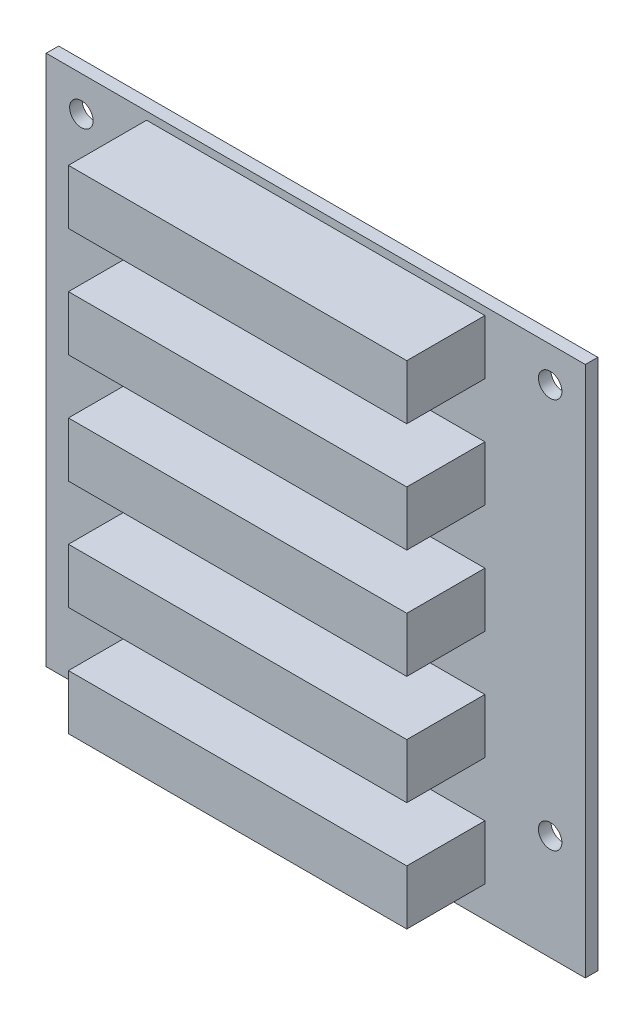
ISO-10303-21;
HEADER;
FILE_DESCRIPTION(('STEP AP214'),'2;1');
FILE_NAME('part.step','',(''),(''),'','','');
FILE_SCHEMA(('AUTOMOTIVE_DESIGN { 1 0 10303 214 1 1 1 1 }'));
ENDSEC;
DATA;
#1=APPLICATION_CONTEXT('core data for automotive mechanical design processes');
#2=APPLICATION_PROTOCOL_DEFINITION('international standard','automotive_design',2000,#1);
#3=PRODUCT_CONTEXT('',#1,'mechanical');
#4=PRODUCT('Part','Part','',(#3));
#5=PRODUCT_RELATED_PRODUCT_CATEGORY('part','',(#4));
#6=PRODUCT_DEFINITION_FORMATION('','',#4);
#7=PRODUCT_DEFINITION_CONTEXT('part definition',#1,'design');
#8=PRODUCT_DEFINITION('design','',#6,#7);
#9=PRODUCT_DEFINITION_SHAPE('','',#8);
#10=(LENGTH_UNIT() NAMED_UNIT(*) SI_UNIT(.MILLI.,.METRE.));
#11=(NAMED_UNIT(*) PLANE_ANGLE_UNIT() SI_UNIT($,.RADIAN.));
#12=(NAMED_UNIT(*) SI_UNIT($,.STERADIAN.) SOLID_ANGLE_UNIT());
#13=UNCERTAINTY_MEASURE_WITH_UNIT(LENGTH_MEASURE(1.E-05),#10,'distance_accuracy_value','');
#14=(GEOMETRIC_REPRESENTATION_CONTEXT(3) GLOBAL_UNCERTAINTY_ASSIGNED_CONTEXT((#13)) GLOBAL_UNIT_ASSIGNED_CONTEXT((#10,
#11,#12)) REPRESENTATION_CONTEXT('',''));
#15=CARTESIAN_POINT('',(0.,0.,0.));
#16=DIRECTION('',(0.,0.,1.));
#17=DIRECTION('',(1.,0.,0.));
#18=AXIS2_PLACEMENT_3D('',#15,#16,#17);
#19=CARTESIAN_POINT('',(34.5,7.50000000000001,11.6));
#20=DIRECTION('',(0.,0.,1.));
#21=DIRECTION('',(1.,0.,0.));
#22=AXIS2_PLACEMENT_3D('',#19,#20,#21);
#23=PLANE('',#22);
#24=DIRECTION('',(1.,0.,0.));
#25=VECTOR('',#24,1.);
#26=CARTESIAN_POINT('',(12.85,11.,11.6));
#27=LINE('',#26,#25);
#28=CARTESIAN_POINT('',(12.85,11.,11.6));
#29=VERTEX_POINT('',#28);
#30=CARTESIAN_POINT('',(56.15,11.,11.6));
#31=VERTEX_POINT('',#30);
#32=EDGE_CURVE('E194',#29,#31,#27,.T.);
#33=ORIENTED_EDGE('',*,*,#32,.F.);
#34=DIRECTION('',(0.,1.,0.));
#35=VECTOR('',#34,1.);
#36=CARTESIAN_POINT('',(12.85,4.00000000000001,11.6));
#37=LINE('',#36,#35);
#38=CARTESIAN_POINT('',(12.85,4.00000000000001,11.6));
#39=VERTEX_POINT('',#38);
#40=EDGE_CURVE('E176',#39,#29,#37,.T.);
#41=ORIENTED_EDGE('',*,*,#40,.F.);
#42=DIRECTION('',(1.,0.,0.));
#43=VECTOR('',#42,1.);
#44=CARTESIAN_POINT('',(56.15,4.00000000000001,11.6));
#45=LINE('',#44,#43);
#46=CARTESIAN_POINT('',(56.15,4.00000000000001,11.6));
#47=VERTEX_POINT('',#46);
#48=EDGE_CURVE('E183',#47,#39,#45,.F.);
#49=ORIENTED_EDGE('',*,*,#48,.F.);
#50=DIRECTION('',(0.,1.,0.));
#51=VECTOR('',#50,1.);
#52=CARTESIAN_POINT('',(56.15,11.,11.6));
#53=LINE('',#52,#51);
#54=EDGE_CURVE('E367',#31,#47,#53,.F.);
#55=ORIENTED_EDGE('',*,*,#54,.F.);
#56=EDGE_LOOP('',(#33,#41,#49,#55));
#57=FACE_BOUND('',#56,.T.);
#58=ADVANCED_FACE('F17',(#57),#23,.T.);
#59=CARTESIAN_POINT('',(34.5,35.5,11.6));
#60=DIRECTION('',(0.,0.,1.));
#61=DIRECTION('',(1.,0.,0.));
#62=AXIS2_PLACEMENT_3D('',#59,#60,#61);
#63=PLANE('',#62);
#64=DIRECTION('',(1.,0.,0.));
#65=VECTOR('',#64,1.);
#66=CARTESIAN_POINT('',(12.85,39.,11.6));
#67=LINE('',#66,#65);
#68=CARTESIAN_POINT('',(12.85,39.,11.6));
#69=VERTEX_POINT('',#68);
#70=CARTESIAN_POINT('',(56.15,39.,11.6));
#71=VERTEX_POINT('',#70);
#72=EDGE_CURVE('E354',#69,#71,#67,.T.);
#73=ORIENTED_EDGE('',*,*,#72,.F.);
#74=DIRECTION('',(0.,1.,0.));
#75=VECTOR('',#74,1.);
#76=CARTESIAN_POINT('',(12.85,32.,11.6));
#77=LINE('',#76,#75);
#78=CARTESIAN_POINT('',(12.85,32.,11.6));
#79=VERTEX_POINT('',#78);
#80=EDGE_CURVE('E359',#79,#69,#77,.T.);
#81=ORIENTED_EDGE('',*,*,#80,.F.);
#82=DIRECTION('',(1.,0.,0.));
#83=VECTOR('',#82,1.);
#84=CARTESIAN_POINT('',(56.15,32.,11.6));
#85=LINE('',#84,#83);
#86=CARTESIAN_POINT('',(56.15,32.,11.6));
#87=VERTEX_POINT('',#86);
#88=EDGE_CURVE('E361',#87,#79,#85,.F.);
#89=ORIENTED_EDGE('',*,*,#88,.F.);
#90=DIRECTION('',(0.,1.,0.));
#91=VECTOR('',#90,1.);
#92=CARTESIAN_POINT('',(56.15,39.,11.6));
#93=LINE('',#92,#91);
#94=EDGE_CURVE('E349',#71,#87,#93,.F.);
#95=ORIENTED_EDGE('',*,*,#94,.F.);
#96=EDGE_LOOP('',(#73,#81,#89,#95));
#97=FACE_BOUND('',#96,.T.);
#98=ADVANCED_FACE('F723',(#97),#63,.T.);
#99=CARTESIAN_POINT('',(34.5,21.5,11.6));
#100=DIRECTION('',(0.,0.,1.));
#101=DIRECTION('',(1.,0.,0.));
#102=AXIS2_PLACEMENT_3D('',#99,#100,#101);
#103=PLANE('',#102);
#104=DIRECTION('',(1.,0.,0.));
#105=VECTOR('',#104,1.);
#106=CARTESIAN_POINT('',(12.85,25.,11.6));
#107=LINE('',#106,#105);
#108=CARTESIAN_POINT('',(12.85,25.,11.6));
#109=VERTEX_POINT('',#108);
#110=CARTESIAN_POINT('',(56.15,25.,11.6));
#111=VERTEX_POINT('',#110);
#112=EDGE_CURVE('E335',#109,#111,#107,.T.);
#113=ORIENTED_EDGE('',*,*,#112,.F.);
#114=DIRECTION('',(0.,1.,0.));
#115=VECTOR('',#114,1.);
#116=CARTESIAN_POINT('',(12.85,18.,11.6));
#117=LINE('',#116,#115);
#118=CARTESIAN_POINT('',(12.85,18.,11.6));
#119=VERTEX_POINT('',#118);
#120=EDGE_CURVE('E340',#119,#109,#117,.T.);
#121=ORIENTED_EDGE('',*,*,#120,.F.);
#122=DIRECTION('',(1.,0.,0.));
#123=VECTOR('',#122,1.);
#124=CARTESIAN_POINT('',(56.15,18.,11.6));
#125=LINE('',#124,#123);
#126=CARTESIAN_POINT('',(56.15,18.,11.6));
#127=VERTEX_POINT('',#126);
#128=EDGE_CURVE('E342',#127,#119,#125,.F.);
#129=ORIENTED_EDGE('',*,*,#128,.F.);
#130=DIRECTION('',(0.,1.,0.));
#131=VECTOR('',#130,1.);
#132=CARTESIAN_POINT('',(56.15,25.,11.6));
#133=LINE('',#132,#131);
#134=EDGE_CURVE('E330',#111,#127,#133,.F.);
#135=ORIENTED_EDGE('',*,*,#134,.F.);
#136=EDGE_LOOP('',(#113,#121,#129,#135));
#137=FACE_BOUND('',#136,.T.);
#138=ADVANCED_FACE('F713',(#137),#103,.T.);
#139=CARTESIAN_POINT('',(34.5,49.5,11.6));
#140=DIRECTION('',(0.,0.,1.));
#141=DIRECTION('',(1.,0.,0.));
#142=AXIS2_PLACEMENT_3D('',#139,#140,#141);
#143=PLANE('',#142);
#144=DIRECTION('',(1.,0.,0.));
#145=VECTOR('',#144,1.);
#146=CARTESIAN_POINT('',(12.85,53.,11.6));
#147=LINE('',#146,#145);
#148=CARTESIAN_POINT('',(12.85,53.,11.6));
#149=VERTEX_POINT('',#148);
#150=CARTESIAN_POINT('',(56.15,53.,11.6));
#151=VERTEX_POINT('',#150);
#152=EDGE_CURVE('E316',#149,#151,#147,.T.);
#153=ORIENTED_EDGE('',*,*,#152,.F.);
#154=DIRECTION('',(0.,1.,0.));
#155=VECTOR('',#154,1.);
#156=CARTESIAN_POINT('',(12.85,46.,11.6));
#157=LINE('',#156,#155);
#158=CARTESIAN_POINT('',(12.85,46.,11.6));
#159=VERTEX_POINT('',#158);
#160=EDGE_CURVE('E321',#159,#149,#157,.T.);
#161=ORIENTED_EDGE('',*,*,#160,.F.);
#162=DIRECTION('',(1.,0.,0.));
#163=VECTOR('',#162,1.);
#164=CARTESIAN_POINT('',(56.15,46.,11.6));
#165=LINE('',#164,#163);
#166=CARTESIAN_POINT('',(56.15,46.,11.6));
#167=VERTEX_POINT('',#166);
#168=EDGE_CURVE('E323',#167,#159,#165,.F.);
#169=ORIENTED_EDGE('',*,*,#168,.F.);
#170=DIRECTION('',(0.,1.,0.));
#171=VECTOR('',#170,1.);
#172=CARTESIAN_POINT('',(56.15,53.,11.6));
#173=LINE('',#172,#171);
#174=EDGE_CURVE('E311',#151,#167,#173,.F.);
#175=ORIENTED_EDGE('',*,*,#174,.F.);
#176=EDGE_LOOP('',(#153,#161,#169,#175));
#177=FACE_BOUND('',#176,.T.);
#178=ADVANCED_FACE('F703',(#177),#143,.T.);
#179=CARTESIAN_POINT('',(34.5,63.5,11.6));
#180=DIRECTION('',(0.,0.,1.));
#181=DIRECTION('',(1.,0.,0.));
#182=AXIS2_PLACEMENT_3D('',#179,#180,#181);
#183=PLANE('',#182);
#184=DIRECTION('',(0.,1.,0.));
#185=VECTOR('',#184,1.);
#186=CARTESIAN_POINT('',(12.85,60.,11.6));
#187=LINE('',#186,#185);
#188=CARTESIAN_POINT('',(12.85,60.,11.6));
#189=VERTEX_POINT('',#188);
#190=CARTESIAN_POINT('',(12.85,67.,11.6));
#191=VERTEX_POINT('',#190);
#192=EDGE_CURVE('E297',#189,#191,#187,.T.);
#193=ORIENTED_EDGE('',*,*,#192,.F.);
#194=DIRECTION('',(1.,0.,0.));
#195=VECTOR('',#194,1.);
#196=CARTESIAN_POINT('',(56.15,60.,11.6));
#197=LINE('',#196,#195);
#198=CARTESIAN_POINT('',(56.15,60.,11.6));
#199=VERTEX_POINT('',#198);
#200=EDGE_CURVE('E302',#199,#189,#197,.F.);
#201=ORIENTED_EDGE('',*,*,#200,.F.);
#202=DIRECTION('',(0.,1.,0.));
#203=VECTOR('',#202,1.);
#204=CARTESIAN_POINT('',(56.15,67.,11.6));
#205=LINE('',#204,#203);
#206=CARTESIAN_POINT('',(56.15,67.,11.6));
#207=VERTEX_POINT('',#206);
#208=EDGE_CURVE('E304',#207,#199,#205,.F.);
#209=ORIENTED_EDGE('',*,*,#208,.F.);
#210=DIRECTION('',(1.,0.,0.));
#211=VECTOR('',#210,1.);
#212=CARTESIAN_POINT('',(12.85,67.,11.6));
#213=LINE('',#212,#211);
#214=EDGE_CURVE('E292',#191,#207,#213,.T.);
#215=ORIENTED_EDGE('',*,*,#214,.F.);
#216=EDGE_LOOP('',(#193,#201,#209,#215));
#217=FACE_BOUND('',#216,.T.);
#218=ADVANCED_FACE('F694',(#217),#183,.T.);
#219=CARTESIAN_POINT('',(56.15,4.00000000000001,1.6));
#220=DIRECTION('',(0.,-1.,0.));
#221=DIRECTION('',(0.,0.,-1.));
#222=AXIS2_PLACEMENT_3D('',#219,#220,#221);
#223=PLANE('',#222);
#224=DIRECTION('',(1.,0.,0.));
#225=VECTOR('',#224,1.);
#226=CARTESIAN_POINT('',(34.5,4.00000000000001,1.6));
#227=LINE('',#226,#225);
#228=CARTESIAN_POINT('',(56.15,4.00000000000001,1.6));
#229=VERTEX_POINT('',#228);
#230=CARTESIAN_POINT('',(12.85,4.00000000000001,1.6));
#231=VERTEX_POINT('',#230);
#232=EDGE_CURVE('E285',#229,#231,#227,.F.);
#233=ORIENTED_EDGE('',*,*,#232,.F.);
#234=DIRECTION('',(0.,0.,-1.));
#235=VECTOR('',#234,1.);
#236=CARTESIAN_POINT('',(56.15,4.00000000000001,1.6));
#237=LINE('',#236,#235);
#238=EDGE_CURVE('E188',#47,#229,#237,.T.);
#239=ORIENTED_EDGE('',*,*,#238,.F.);
#240=ORIENTED_EDGE('',*,*,#48,.T.);
#241=DIRECTION('',(0.,0.,1.));
#242=VECTOR('',#241,1.);
#243=CARTESIAN_POINT('',(12.85,4.00000000000001,1.6));
#244=LINE('',#243,#242);
#245=EDGE_CURVE('E186',#231,#39,#244,.T.);
#246=ORIENTED_EDGE('',*,*,#245,.F.);
#247=EDGE_LOOP('',(#233,#239,#240,#246));
#248=FACE_BOUND('',#247,.T.);
#249=ADVANCED_FACE('F185',(#248),#223,.T.);
#250=CARTESIAN_POINT('',(12.85,4.00000000000001,1.6));
#251=DIRECTION('',(-1.,0.,0.));
#252=DIRECTION('',(0.,0.,1.));
#253=AXIS2_PLACEMENT_3D('',#250,#251,#252);
#254=PLANE('',#253);
#255=DIRECTION('',(0.,1.,0.));
#256=VECTOR('',#255,1.);
#257=CARTESIAN_POINT('',(12.85,34.,1.6));
#258=LINE('',#257,#256);
#259=CARTESIAN_POINT('',(12.85,11.,1.6));
#260=VERTEX_POINT('',#259);
#261=EDGE_CURVE('E193',#231,#260,#258,.T.);
#262=ORIENTED_EDGE('',*,*,#261,.F.);
#263=ORIENTED_EDGE('',*,*,#245,.T.);
#264=ORIENTED_EDGE('',*,*,#40,.T.);
#265=DIRECTION('',(0.,0.,1.));
#266=VECTOR('',#265,1.);
#267=CARTESIAN_POINT('',(12.85,11.,1.6));
#268=LINE('',#267,#266);
#269=EDGE_CURVE('E369',#260,#29,#268,.T.);
#270=ORIENTED_EDGE('',*,*,#269,.F.);
#271=EDGE_LOOP('',(#262,#263,#264,#270));
#272=FACE_BOUND('',#271,.T.);
#273=ADVANCED_FACE('F192',(#272),#254,.T.);
#274=CARTESIAN_POINT('',(12.85,11.,1.6));
#275=DIRECTION('',(0.,1.,0.));
#276=DIRECTION('',(0.,0.,1.));
#277=AXIS2_PLACEMENT_3D('',#274,#275,#276);
#278=PLANE('',#277);
#279=DIRECTION('',(1.,0.,0.));
#280=VECTOR('',#279,1.);
#281=CARTESIAN_POINT('',(34.5,11.,1.6));
#282=LINE('',#281,#280);
#283=CARTESIAN_POINT('',(56.15,11.,1.6));
#284=VERTEX_POINT('',#283);
#285=EDGE_CURVE('E282',#260,#284,#282,.T.);
#286=ORIENTED_EDGE('',*,*,#285,.F.);
#287=ORIENTED_EDGE('',*,*,#269,.T.);
#288=ORIENTED_EDGE('',*,*,#32,.T.);
#289=DIRECTION('',(0.,0.,-1.));
#290=VECTOR('',#289,1.);
#291=CARTESIAN_POINT('',(56.15,11.,1.6));
#292=LINE('',#291,#290);
#293=EDGE_CURVE('E363',#284,#31,#292,.F.);
#294=ORIENTED_EDGE('',*,*,#293,.F.);
#295=EDGE_LOOP('',(#286,#287,#288,#294));
#296=FACE_BOUND('',#295,.T.);
#297=ADVANCED_FACE('F373',(#296),#278,.T.);
#298=CARTESIAN_POINT('',(56.15,11.,1.6));
#299=DIRECTION('',(1.,0.,0.));
#300=DIRECTION('',(0.,0.,-1.));
#301=AXIS2_PLACEMENT_3D('',#298,#299,#300);
#302=PLANE('',#301);
#303=DIRECTION('',(0.,1.,0.));
#304=VECTOR('',#303,1.);
#305=CARTESIAN_POINT('',(56.15,34.,1.6));
#306=LINE('',#305,#304);
#307=EDGE_CURVE('E279',#284,#229,#306,.F.);
#308=ORIENTED_EDGE('',*,*,#307,.F.);
#309=ORIENTED_EDGE('',*,*,#293,.T.);
#310=ORIENTED_EDGE('',*,*,#54,.T.);
#311=ORIENTED_EDGE('',*,*,#238,.T.);
#312=EDGE_LOOP('',(#308,#309,#310,#311));
#313=FACE_BOUND('',#312,.T.);
#314=ADVANCED_FACE('F376',(#313),#302,.T.);
#315=CARTESIAN_POINT('',(56.15,32.,1.6));
#316=DIRECTION('',(0.,-1.,0.));
#317=DIRECTION('',(0.,0.,-1.));
#318=AXIS2_PLACEMENT_3D('',#315,#316,#317);
#319=PLANE('',#318);
#320=DIRECTION('',(1.,0.,0.));
#321=VECTOR('',#320,1.);
#322=CARTESIAN_POINT('',(34.5,32.,1.6));
#323=LINE('',#322,#321);
#324=CARTESIAN_POINT('',(56.15,32.,1.6));
#325=VERTEX_POINT('',#324);
#326=CARTESIAN_POINT('',(12.85,32.,1.6));
#327=VERTEX_POINT('',#326);
#328=EDGE_CURVE('E277',#325,#327,#323,.F.);
#329=ORIENTED_EDGE('',*,*,#328,.F.);
#330=DIRECTION('',(0.,0.,-1.));
#331=VECTOR('',#330,1.);
#332=CARTESIAN_POINT('',(56.15,32.,1.6));
#333=LINE('',#332,#331);
#334=EDGE_CURVE('E347',#87,#325,#333,.T.);
#335=ORIENTED_EDGE('',*,*,#334,.F.);
#336=ORIENTED_EDGE('',*,*,#88,.T.);
#337=DIRECTION('',(0.,0.,1.));
#338=VECTOR('',#337,1.);
#339=CARTESIAN_POINT('',(12.85,32.,1.6));
#340=LINE('',#339,#338);
#341=EDGE_CURVE('E356',#327,#79,#340,.T.);
#342=ORIENTED_EDGE('',*,*,#341,.F.);
#343=EDGE_LOOP('',(#329,#335,#336,#342));
#344=FACE_BOUND('',#343,.T.);
#345=ADVANCED_FACE('F651',(#344),#319,.T.);
#346=CARTESIAN_POINT('',(12.85,32.,1.6));
#347=DIRECTION('',(-1.,0.,0.));
#348=DIRECTION('',(0.,0.,1.));
#349=AXIS2_PLACEMENT_3D('',#346,#347,#348);
#350=PLANE('',#349);
#351=DIRECTION('',(0.,1.,0.));
#352=VECTOR('',#351,1.);
#353=CARTESIAN_POINT('',(12.85,34.,1.6));
#354=LINE('',#353,#352);
#355=CARTESIAN_POINT('',(12.85,39.,1.6));
#356=VERTEX_POINT('',#355);
#357=EDGE_CURVE('E275',#327,#356,#354,.T.);
#358=ORIENTED_EDGE('',*,*,#357,.F.);
#359=ORIENTED_EDGE('',*,*,#341,.T.);
#360=ORIENTED_EDGE('',*,*,#80,.T.);
#361=DIRECTION('',(0.,0.,1.));
#362=VECTOR('',#361,1.);
#363=CARTESIAN_POINT('',(12.85,39.,1.6));
#364=LINE('',#363,#362);
#365=EDGE_CURVE('E351',#356,#69,#364,.T.);
#366=ORIENTED_EDGE('',*,*,#365,.F.);
#367=EDGE_LOOP('',(#358,#359,#360,#366));
#368=FACE_BOUND('',#367,.T.);
#369=ADVANCED_FACE('F641',(#368),#350,.T.);
#370=CARTESIAN_POINT('',(12.85,39.,1.6));
#371=DIRECTION('',(0.,1.,0.));
#372=DIRECTION('',(0.,0.,1.));
#373=AXIS2_PLACEMENT_3D('',#370,#371,#372);
#374=PLANE('',#373);
#375=DIRECTION('',(1.,0.,0.));
#376=VECTOR('',#375,1.);
#377=CARTESIAN_POINT('',(34.5,39.,1.6));
#378=LINE('',#377,#376);
#379=CARTESIAN_POINT('',(56.15,39.,1.6));
#380=VERTEX_POINT('',#379);
#381=EDGE_CURVE('E273',#356,#380,#378,.T.);
#382=ORIENTED_EDGE('',*,*,#381,.F.);
#383=ORIENTED_EDGE('',*,*,#365,.T.);
#384=ORIENTED_EDGE('',*,*,#72,.T.);
#385=DIRECTION('',(0.,0.,-1.));
#386=VECTOR('',#385,1.);
#387=CARTESIAN_POINT('',(56.15,39.,1.6));
#388=LINE('',#387,#386);
#389=EDGE_CURVE('E344',#380,#71,#388,.F.);
#390=ORIENTED_EDGE('',*,*,#389,.F.);
#391=EDGE_LOOP('',(#382,#383,#384,#390));
#392=FACE_BOUND('',#391,.T.);
#393=ADVANCED_FACE('F631',(#392),#374,.T.);
#394=CARTESIAN_POINT('',(56.15,39.,1.6));
#395=DIRECTION('',(1.,0.,0.));
#396=DIRECTION('',(0.,0.,-1.));
#397=AXIS2_PLACEMENT_3D('',#394,#395,#396);
#398=PLANE('',#397);
#399=DIRECTION('',(0.,1.,0.));
#400=VECTOR('',#399,1.);
#401=CARTESIAN_POINT('',(56.15,34.,1.6));
#402=LINE('',#401,#400);
#403=EDGE_CURVE('E270',#380,#325,#402,.F.);
#404=ORIENTED_EDGE('',*,*,#403,.F.);
#405=ORIENTED_EDGE('',*,*,#389,.T.);
#406=ORIENTED_EDGE('',*,*,#94,.T.);
#407=ORIENTED_EDGE('',*,*,#334,.T.);
#408=EDGE_LOOP('',(#404,#405,#406,#407));
#409=FACE_BOUND('',#408,.T.);
#410=ADVANCED_FACE('F621',(#409),#398,.T.);
#411=CARTESIAN_POINT('',(56.15,18.,1.6));
#412=DIRECTION('',(0.,-1.,0.));
#413=DIRECTION('',(0.,0.,-1.));
#414=AXIS2_PLACEMENT_3D('',#411,#412,#413);
#415=PLANE('',#414);
#416=DIRECTION('',(1.,0.,0.));
#417=VECTOR('',#416,1.);
#418=CARTESIAN_POINT('',(34.5,18.,1.6));
#419=LINE('',#418,#417);
#420=CARTESIAN_POINT('',(56.15,18.,1.6));
#421=VERTEX_POINT('',#420);
#422=CARTESIAN_POINT('',(12.85,18.,1.6));
#423=VERTEX_POINT('',#422);
#424=EDGE_CURVE('E268',#421,#423,#419,.F.);
#425=ORIENTED_EDGE('',*,*,#424,.F.);
#426=DIRECTION('',(0.,0.,-1.));
#427=VECTOR('',#426,1.);
#428=CARTESIAN_POINT('',(56.15,18.,1.6));
#429=LINE('',#428,#427);
#430=EDGE_CURVE('E328',#127,#421,#429,.T.);
#431=ORIENTED_EDGE('',*,*,#430,.F.);
#432=ORIENTED_EDGE('',*,*,#128,.T.);
#433=DIRECTION('',(0.,0.,1.));
#434=VECTOR('',#433,1.);
#435=CARTESIAN_POINT('',(12.85,18.,1.6));
#436=LINE('',#435,#434);
#437=EDGE_CURVE('E337',#423,#119,#436,.T.);
#438=ORIENTED_EDGE('',*,*,#437,.F.);
#439=EDGE_LOOP('',(#425,#431,#432,#438));
#440=FACE_BOUND('',#439,.T.);
#441=ADVANCED_FACE('F611',(#440),#415,.T.);
#442=CARTESIAN_POINT('',(12.85,18.,1.6));
#443=DIRECTION('',(-1.,0.,0.));
#444=DIRECTION('',(0.,0.,1.));
#445=AXIS2_PLACEMENT_3D('',#442,#443,#444);
#446=PLANE('',#445);
#447=DIRECTION('',(0.,1.,0.));
#448=VECTOR('',#447,1.);
#449=CARTESIAN_POINT('',(12.85,34.,1.6));
#450=LINE('',#449,#448);
#451=CARTESIAN_POINT('',(12.85,25.,1.6));
#452=VERTEX_POINT('',#451);
#453=EDGE_CURVE('E266',#423,#452,#450,.T.);
#454=ORIENTED_EDGE('',*,*,#453,.F.);
#455=ORIENTED_EDGE('',*,*,#437,.T.);
#456=ORIENTED_EDGE('',*,*,#120,.T.);
#457=DIRECTION('',(0.,0.,1.));
#458=VECTOR('',#457,1.);
#459=CARTESIAN_POINT('',(12.85,25.,1.6));
#460=LINE('',#459,#458);
#461=EDGE_CURVE('E332',#452,#109,#460,.T.);
#462=ORIENTED_EDGE('',*,*,#461,.F.);
#463=EDGE_LOOP('',(#454,#455,#456,#462));
#464=FACE_BOUND('',#463,.T.);
#465=ADVANCED_FACE('F601',(#464),#446,.T.);
#466=CARTESIAN_POINT('',(12.85,25.,1.6));
#467=DIRECTION('',(0.,1.,0.));
#468=DIRECTION('',(0.,0.,1.));
#469=AXIS2_PLACEMENT_3D('',#466,#467,#468);
#470=PLANE('',#469);
#471=DIRECTION('',(1.,0.,0.));
#472=VECTOR('',#471,1.);
#473=CARTESIAN_POINT('',(34.5,25.,1.6));
#474=LINE('',#473,#472);
#475=CARTESIAN_POINT('',(56.15,25.,1.6));
#476=VERTEX_POINT('',#475);
#477=EDGE_CURVE('E264',#452,#476,#474,.T.);
#478=ORIENTED_EDGE('',*,*,#477,.F.);
#479=ORIENTED_EDGE('',*,*,#461,.T.);
#480=ORIENTED_EDGE('',*,*,#112,.T.);
#481=DIRECTION('',(0.,0.,-1.));
#482=VECTOR('',#481,1.);
#483=CARTESIAN_POINT('',(56.15,25.,1.6));
#484=LINE('',#483,#482);
#485=EDGE_CURVE('E325',#476,#111,#484,.F.);
#486=ORIENTED_EDGE('',*,*,#485,.F.);
#487=EDGE_LOOP('',(#478,#479,#480,#486));
#488=FACE_BOUND('',#487,.T.);
#489=ADVANCED_FACE('F591',(#488),#470,.T.);
#490=CARTESIAN_POINT('',(56.15,25.,1.6));
#491=DIRECTION('',(1.,0.,0.));
#492=DIRECTION('',(0.,0.,-1.));
#493=AXIS2_PLACEMENT_3D('',#490,#491,#492);
#494=PLANE('',#493);
#495=DIRECTION('',(0.,1.,0.));
#496=VECTOR('',#495,1.);
#497=CARTESIAN_POINT('',(56.15,34.,1.6));
#498=LINE('',#497,#496);
#499=EDGE_CURVE('E261',#476,#421,#498,.F.);
#500=ORIENTED_EDGE('',*,*,#499,.F.);
#501=ORIENTED_EDGE('',*,*,#485,.T.);
#502=ORIENTED_EDGE('',*,*,#134,.T.);
#503=ORIENTED_EDGE('',*,*,#430,.T.);
#504=EDGE_LOOP('',(#500,#501,#502,#503));
#505=FACE_BOUND('',#504,.T.);
#506=ADVANCED_FACE('F581',(#505),#494,.T.);
#507=CARTESIAN_POINT('',(56.15,46.,1.6));
#508=DIRECTION('',(0.,-1.,0.));
#509=DIRECTION('',(0.,0.,-1.));
#510=AXIS2_PLACEMENT_3D('',#507,#508,#509);
#511=PLANE('',#510);
#512=DIRECTION('',(1.,0.,0.));
#513=VECTOR('',#512,1.);
#514=CARTESIAN_POINT('',(34.5,46.,1.6));
#515=LINE('',#514,#513);
#516=CARTESIAN_POINT('',(56.15,46.,1.6));
#517=VERTEX_POINT('',#516);
#518=CARTESIAN_POINT('',(12.85,46.,1.6));
#519=VERTEX_POINT('',#518);
#520=EDGE_CURVE('E259',#517,#519,#515,.F.);
#521=ORIENTED_EDGE('',*,*,#520,.F.);
#522=DIRECTION('',(0.,0.,-1.));
#523=VECTOR('',#522,1.);
#524=CARTESIAN_POINT('',(56.15,46.,1.6));
#525=LINE('',#524,#523);
#526=EDGE_CURVE('E309',#167,#517,#525,.T.);
#527=ORIENTED_EDGE('',*,*,#526,.F.);
#528=ORIENTED_EDGE('',*,*,#168,.T.);
#529=DIRECTION('',(0.,0.,1.));
#530=VECTOR('',#529,1.);
#531=CARTESIAN_POINT('',(12.85,46.,1.6));
#532=LINE('',#531,#530);
#533=EDGE_CURVE('E318',#519,#159,#532,.T.);
#534=ORIENTED_EDGE('',*,*,#533,.F.);
#535=EDGE_LOOP('',(#521,#527,#528,#534));
#536=FACE_BOUND('',#535,.T.);
#537=ADVANCED_FACE('F571',(#536),#511,.T.);
#538=CARTESIAN_POINT('',(12.85,46.,1.6));
#539=DIRECTION('',(-1.,0.,0.));
#540=DIRECTION('',(0.,0.,1.));
#541=AXIS2_PLACEMENT_3D('',#538,#539,#540);
#542=PLANE('',#541);
#543=DIRECTION('',(0.,1.,0.));
#544=VECTOR('',#543,1.);
#545=CARTESIAN_POINT('',(12.85,34.,1.6));
#546=LINE('',#545,#544);
#547=CARTESIAN_POINT('',(12.85,53.,1.6));
#548=VERTEX_POINT('',#547);
#549=EDGE_CURVE('E257',#519,#548,#546,.T.);
#550=ORIENTED_EDGE('',*,*,#549,.F.);
#551=ORIENTED_EDGE('',*,*,#533,.T.);
#552=ORIENTED_EDGE('',*,*,#160,.T.);
#553=DIRECTION('',(0.,0.,1.));
#554=VECTOR('',#553,1.);
#555=CARTESIAN_POINT('',(12.85,53.,1.6));
#556=LINE('',#555,#554);
#557=EDGE_CURVE('E313',#548,#149,#556,.T.);
#558=ORIENTED_EDGE('',*,*,#557,.F.);
#559=EDGE_LOOP('',(#550,#551,#552,#558));
#560=FACE_BOUND('',#559,.T.);
#561=ADVANCED_FACE('F561',(#560),#542,.T.);
#562=CARTESIAN_POINT('',(12.85,53.,1.6));
#563=DIRECTION('',(0.,1.,0.));
#564=DIRECTION('',(0.,0.,1.));
#565=AXIS2_PLACEMENT_3D('',#562,#563,#564);
#566=PLANE('',#565);
#567=DIRECTION('',(1.,0.,0.));
#568=VECTOR('',#567,1.);
#569=CARTESIAN_POINT('',(34.5,53.,1.6));
#570=LINE('',#569,#568);
#571=CARTESIAN_POINT('',(56.15,53.,1.6));
#572=VERTEX_POINT('',#571);
#573=EDGE_CURVE('E255',#548,#572,#570,.T.);
#574=ORIENTED_EDGE('',*,*,#573,.F.);
#575=ORIENTED_EDGE('',*,*,#557,.T.);
#576=ORIENTED_EDGE('',*,*,#152,.T.);
#577=DIRECTION('',(0.,0.,-1.));
#578=VECTOR('',#577,1.);
#579=CARTESIAN_POINT('',(56.15,53.,1.6));
#580=LINE('',#579,#578);
#581=EDGE_CURVE('E306',#572,#151,#580,.F.);
#582=ORIENTED_EDGE('',*,*,#581,.F.);
#583=EDGE_LOOP('',(#574,#575,#576,#582));
#584=FACE_BOUND('',#583,.T.);
#585=ADVANCED_FACE('F551',(#584),#566,.T.);
#586=CARTESIAN_POINT('',(56.15,53.,1.6));
#587=DIRECTION('',(1.,0.,0.));
#588=DIRECTION('',(0.,0.,-1.));
#589=AXIS2_PLACEMENT_3D('',#586,#587,#588);
#590=PLANE('',#589);
#591=DIRECTION('',(0.,1.,0.));
#592=VECTOR('',#591,1.);
#593=CARTESIAN_POINT('',(56.15,34.,1.6));
#594=LINE('',#593,#592);
#595=EDGE_CURVE('E252',#572,#517,#594,.F.);
#596=ORIENTED_EDGE('',*,*,#595,.F.);
#597=ORIENTED_EDGE('',*,*,#581,.T.);
#598=ORIENTED_EDGE('',*,*,#174,.T.);
#599=ORIENTED_EDGE('',*,*,#526,.T.);
#600=EDGE_LOOP('',(#596,#597,#598,#599));
#601=FACE_BOUND('',#600,.T.);
#602=ADVANCED_FACE('F541',(#601),#590,.T.);
#603=CARTESIAN_POINT('',(56.15,67.,1.6));
#604=DIRECTION('',(1.,0.,0.));
#605=DIRECTION('',(0.,0.,-1.));
#606=AXIS2_PLACEMENT_3D('',#603,#604,#605);
#607=PLANE('',#606);
#608=DIRECTION('',(0.,1.,0.));
#609=VECTOR('',#608,1.);
#610=CARTESIAN_POINT('',(56.15,34.,1.6));
#611=LINE('',#610,#609);
#612=CARTESIAN_POINT('',(56.15,67.,1.6));
#613=VERTEX_POINT('',#612);
#614=CARTESIAN_POINT('',(56.15,60.,1.6));
#615=VERTEX_POINT('',#614);
#616=EDGE_CURVE('E250',#613,#615,#611,.F.);
#617=ORIENTED_EDGE('',*,*,#616,.F.);
#618=DIRECTION('',(0.,0.,1.));
#619=VECTOR('',#618,1.);
#620=CARTESIAN_POINT('',(56.15,67.,1.6));
#621=LINE('',#620,#619);
#622=EDGE_CURVE('E290',#207,#613,#621,.F.);
#623=ORIENTED_EDGE('',*,*,#622,.F.);
#624=ORIENTED_EDGE('',*,*,#208,.T.);
#625=DIRECTION('',(0.,0.,-1.));
#626=VECTOR('',#625,1.);
#627=CARTESIAN_POINT('',(56.15,60.,1.6));
#628=LINE('',#627,#626);
#629=EDGE_CURVE('E299',#615,#199,#628,.F.);
#630=ORIENTED_EDGE('',*,*,#629,.F.);
#631=EDGE_LOOP('',(#617,#623,#624,#630));
#632=FACE_BOUND('',#631,.T.);
#633=ADVANCED_FACE('F531',(#632),#607,.T.);
#634=CARTESIAN_POINT('',(56.15,60.,1.6));
#635=DIRECTION('',(0.,-1.,0.));
#636=DIRECTION('',(0.,0.,-1.));
#637=AXIS2_PLACEMENT_3D('',#634,#635,#636);
#638=PLANE('',#637);
#639=DIRECTION('',(1.,0.,0.));
#640=VECTOR('',#639,1.);
#641=CARTESIAN_POINT('',(34.5,60.,1.6));
#642=LINE('',#641,#640);
#643=CARTESIAN_POINT('',(12.85,60.,1.6));
#644=VERTEX_POINT('',#643);
#645=EDGE_CURVE('E248',#615,#644,#642,.F.);
#646=ORIENTED_EDGE('',*,*,#645,.F.);
#647=ORIENTED_EDGE('',*,*,#629,.T.);
#648=ORIENTED_EDGE('',*,*,#200,.T.);
#649=DIRECTION('',(0.,0.,1.));
#650=VECTOR('',#649,1.);
#651=CARTESIAN_POINT('',(12.85,60.,1.6));
#652=LINE('',#651,#650);
#653=EDGE_CURVE('E294',#644,#189,#652,.T.);
#654=ORIENTED_EDGE('',*,*,#653,.F.);
#655=EDGE_LOOP('',(#646,#647,#648,#654));
#656=FACE_BOUND('',#655,.T.);
#657=ADVANCED_FACE('F521',(#656),#638,.T.);
#658=CARTESIAN_POINT('',(12.85,60.,1.6));
#659=DIRECTION('',(-1.,0.,0.));
#660=DIRECTION('',(0.,0.,1.));
#661=AXIS2_PLACEMENT_3D('',#658,#659,#660);
#662=PLANE('',#661);
#663=DIRECTION('',(0.,1.,0.));
#664=VECTOR('',#663,1.);
#665=CARTESIAN_POINT('',(12.85,34.,1.6));
#666=LINE('',#665,#664);
#667=CARTESIAN_POINT('',(12.85,67.,1.6));
#668=VERTEX_POINT('',#667);
#669=EDGE_CURVE('E246',#644,#668,#666,.T.);
#670=ORIENTED_EDGE('',*,*,#669,.F.);
#671=ORIENTED_EDGE('',*,*,#653,.T.);
#672=ORIENTED_EDGE('',*,*,#192,.T.);
#673=DIRECTION('',(0.,0.,1.));
#674=VECTOR('',#673,1.);
#675=CARTESIAN_POINT('',(12.85,67.,1.6));
#676=LINE('',#675,#674);
#677=EDGE_CURVE('E287',#668,#191,#676,.T.);
#678=ORIENTED_EDGE('',*,*,#677,.F.);
#679=EDGE_LOOP('',(#670,#671,#672,#678));
#680=FACE_BOUND('',#679,.T.);
#681=ADVANCED_FACE('F511',(#680),#662,.T.);
#682=CARTESIAN_POINT('',(12.85,67.,1.6));
#683=DIRECTION('',(0.,1.,0.));
#684=DIRECTION('',(0.,0.,1.));
#685=AXIS2_PLACEMENT_3D('',#682,#683,#684);
#686=PLANE('',#685);
#687=DIRECTION('',(1.,0.,0.));
#688=VECTOR('',#687,1.);
#689=CARTESIAN_POINT('',(34.5,67.,1.6));
#690=LINE('',#689,#688);
#691=EDGE_CURVE('E243',#668,#613,#690,.T.);
#692=ORIENTED_EDGE('',*,*,#691,.F.);
#693=ORIENTED_EDGE('',*,*,#677,.T.);
#694=ORIENTED_EDGE('',*,*,#214,.T.);
#695=ORIENTED_EDGE('',*,*,#622,.T.);
#696=EDGE_LOOP('',(#692,#693,#694,#695));
#697=FACE_BOUND('',#696,.T.);
#698=ADVANCED_FACE('F382',(#697),#686,.T.);
#699=CARTESIAN_POINT('',(34.5,34.,1.6));
#700=DIRECTION('',(0.,0.,1.));
#701=DIRECTION('',(1.,0.,0.));
#702=AXIS2_PLACEMENT_3D('',#699,#700,#701);
#703=PLANE('',#702);
#704=CARTESIAN_POINT('',(4.49999999999998,63.5,1.6));
#705=DIRECTION('',(0.,0.,1.));
#706=DIRECTION('',(1.,0.,0.));
#707=AXIS2_PLACEMENT_3D('',#704,#705,#706);
#708=CIRCLE('',#707,1.5);
#709=CARTESIAN_POINT('',(5.99999999999998,63.5,1.6));
#710=VERTEX_POINT('',#709);
#711=EDGE_CURVE('E209',#710,#710,#708,.F.);
#712=ORIENTED_EDGE('',*,*,#711,.T.);
#713=EDGE_LOOP('',(#712));
#714=FACE_BOUND('',#713,.T.);
#715=CARTESIAN_POINT('',(64.5,63.5,1.6));
#716=DIRECTION('',(0.,0.,1.));
#717=DIRECTION('',(1.,0.,0.));
#718=AXIS2_PLACEMENT_3D('',#715,#716,#717);
#719=CIRCLE('',#718,1.5);
#720=CARTESIAN_POINT('',(66.,63.5,1.6));
#721=VERTEX_POINT('',#720);
#722=EDGE_CURVE('E213',#721,#721,#719,.F.);
#723=ORIENTED_EDGE('',*,*,#722,.T.);
#724=EDGE_LOOP('',(#723));
#725=FACE_BOUND('',#724,.T.);
#726=CARTESIAN_POINT('',(4.49999999999998,13.5,1.6));
#727=DIRECTION('',(0.,0.,1.));
#728=DIRECTION('',(1.,0.,0.));
#729=AXIS2_PLACEMENT_3D('',#726,#727,#728);
#730=CIRCLE('',#729,1.5);
#731=CARTESIAN_POINT('',(5.99999999999998,13.5,1.6));
#732=VERTEX_POINT('',#731);
#733=EDGE_CURVE('E215',#732,#732,#730,.F.);
#734=ORIENTED_EDGE('',*,*,#733,.T.);
#735=EDGE_LOOP('',(#734));
#736=FACE_BOUND('',#735,.T.);
#737=CARTESIAN_POINT('',(64.5,13.5,1.6));
#738=DIRECTION('',(0.,0.,1.));
#739=DIRECTION('',(1.,0.,0.));
#740=AXIS2_PLACEMENT_3D('',#737,#738,#739);
#741=CIRCLE('',#740,1.5);
#742=CARTESIAN_POINT('',(66.,13.5,1.6));
#743=VERTEX_POINT('',#742);
#744=EDGE_CURVE('E20',#743,#743,#741,.F.);
#745=ORIENTED_EDGE('',*,*,#744,.T.);
#746=EDGE_LOOP('',(#745));
#747=FACE_BOUND('',#746,.T.);
#748=ORIENTED_EDGE('',*,*,#669,.T.);
#749=ORIENTED_EDGE('',*,*,#691,.T.);
#750=ORIENTED_EDGE('',*,*,#616,.T.);
#751=ORIENTED_EDGE('',*,*,#645,.T.);
#752=EDGE_LOOP('',(#748,#749,#750,#751));
#753=FACE_BOUND('',#752,.T.);
#754=ORIENTED_EDGE('',*,*,#573,.T.);
#755=ORIENTED_EDGE('',*,*,#595,.T.);
#756=ORIENTED_EDGE('',*,*,#520,.T.);
#757=ORIENTED_EDGE('',*,*,#549,.T.);
#758=EDGE_LOOP('',(#754,#755,#756,#757));
#759=FACE_BOUND('',#758,.T.);
#760=ORIENTED_EDGE('',*,*,#477,.T.);
#761=ORIENTED_EDGE('',*,*,#499,.T.);
#762=ORIENTED_EDGE('',*,*,#424,.T.);
#763=ORIENTED_EDGE('',*,*,#453,.T.);
#764=EDGE_LOOP('',(#760,#761,#762,#763));
#765=FACE_BOUND('',#764,.T.);
#766=ORIENTED_EDGE('',*,*,#381,.T.);
#767=ORIENTED_EDGE('',*,*,#403,.T.);
#768=ORIENTED_EDGE('',*,*,#328,.T.);
#769=ORIENTED_EDGE('',*,*,#357,.T.);
#770=EDGE_LOOP('',(#766,#767,#768,#769));
#771=FACE_BOUND('',#770,.T.);
#772=ORIENTED_EDGE('',*,*,#285,.T.);
#773=ORIENTED_EDGE('',*,*,#307,.T.);
#774=ORIENTED_EDGE('',*,*,#232,.T.);
#775=ORIENTED_EDGE('',*,*,#261,.T.);
#776=EDGE_LOOP('',(#772,#773,#774,#775));
#777=FACE_BOUND('',#776,.T.);
#778=DIRECTION('',(0.,1.,0.));
#779=VECTOR('',#778,1.);
#780=CARTESIAN_POINT('',(69.,68.,1.6));
#781=LINE('',#780,#779);
#782=CARTESIAN_POINT('',(69.,68.,1.6));
#783=VERTEX_POINT('',#782);
#784=CARTESIAN_POINT('',(69.,0.,1.6));
#785=VERTEX_POINT('',#784);
#786=EDGE_CURVE('E241',#783,#785,#781,.F.);
#787=ORIENTED_EDGE('',*,*,#786,.F.);
#788=DIRECTION('',(1.,0.,0.));
#789=VECTOR('',#788,1.);
#790=CARTESIAN_POINT('',(0.,68.,1.6));
#791=LINE('',#790,#789);
#792=CARTESIAN_POINT('',(0.,68.,1.6));
#793=VERTEX_POINT('',#792);
#794=EDGE_CURVE('E239',#793,#783,#791,.T.);
#795=ORIENTED_EDGE('',*,*,#794,.F.);
#796=DIRECTION('',(0.,1.,0.));
#797=VECTOR('',#796,1.);
#798=CARTESIAN_POINT('',(0.,0.,1.6));
#799=LINE('',#798,#797);
#800=CARTESIAN_POINT('',(0.,0.,1.6));
#801=VERTEX_POINT('',#800);
#802=EDGE_CURVE('E235',#801,#793,#799,.T.);
#803=ORIENTED_EDGE('',*,*,#802,.F.);
#804=DIRECTION('',(1.,0.,0.));
#805=VECTOR('',#804,1.);
#806=CARTESIAN_POINT('',(69.,0.,1.6));
#807=LINE('',#806,#805);
#808=EDGE_CURVE('E227',#785,#801,#807,.F.);
#809=ORIENTED_EDGE('',*,*,#808,.F.);
#810=EDGE_LOOP('',(#787,#795,#803,#809));
#811=FACE_BOUND('',#810,.T.);
#812=ADVANCED_FACE('F378',(#714,#725,#736,#747,#753,#759,#765,#771,#777,#811),#703,.T.);
#813=CARTESIAN_POINT('',(69.,68.,0.));
#814=DIRECTION('',(1.,0.,0.));
#815=DIRECTION('',(0.,0.,-1.));
#816=AXIS2_PLACEMENT_3D('',#813,#814,#815);
#817=PLANE('',#816);
#818=DIRECTION('',(0.,1.,0.));
#819=VECTOR('',#818,1.);
#820=CARTESIAN_POINT('',(69.,34.,0.));
#821=LINE('',#820,#819);
#822=CARTESIAN_POINT('',(69.,0.,0.));
#823=VERTEX_POINT('',#822);
#824=CARTESIAN_POINT('',(69.,68.,0.));
#825=VERTEX_POINT('',#824);
#826=EDGE_CURVE('E212',#823,#825,#821,.T.);
#827=ORIENTED_EDGE('',*,*,#826,.T.);
#828=DIRECTION('',(0.,0.,1.));
#829=VECTOR('',#828,1.);
#830=CARTESIAN_POINT('',(69.,68.,0.));
#831=LINE('',#830,#829);
#832=EDGE_CURVE('E237',#783,#825,#831,.F.);
#833=ORIENTED_EDGE('',*,*,#832,.F.);
#834=ORIENTED_EDGE('',*,*,#786,.T.);
#835=DIRECTION('',(0.,0.,-1.));
#836=VECTOR('',#835,1.);
#837=CARTESIAN_POINT('',(69.,0.,0.));
#838=LINE('',#837,#836);
#839=EDGE_CURVE('E220',#823,#785,#838,.F.);
#840=ORIENTED_EDGE('',*,*,#839,.F.);
#841=EDGE_LOOP('',(#827,#833,#834,#840));
#842=FACE_BOUND('',#841,.T.);
#843=ADVANCED_FACE('F381',(#842),#817,.T.);
#844=CARTESIAN_POINT('',(0.,68.,0.));
#845=DIRECTION('',(0.,1.,0.));
#846=DIRECTION('',(0.,0.,1.));
#847=AXIS2_PLACEMENT_3D('',#844,#845,#846);
#848=PLANE('',#847);
#849=DIRECTION('',(1.,0.,0.));
#850=VECTOR('',#849,1.);
#851=CARTESIAN_POINT('',(34.5,68.,0.));
#852=LINE('',#851,#850);
#853=CARTESIAN_POINT('',(0.,68.,0.));
#854=VERTEX_POINT('',#853);
#855=EDGE_CURVE('E396',#825,#854,#852,.F.);
#856=ORIENTED_EDGE('',*,*,#855,.T.);
#857=DIRECTION('',(0.,0.,1.));
#858=VECTOR('',#857,1.);
#859=CARTESIAN_POINT('',(0.,68.,0.));
#860=LINE('',#859,#858);
#861=EDGE_CURVE('E233',#793,#854,#860,.F.);
#862=ORIENTED_EDGE('',*,*,#861,.F.);
#863=ORIENTED_EDGE('',*,*,#794,.T.);
#864=ORIENTED_EDGE('',*,*,#832,.T.);
#865=EDGE_LOOP('',(#856,#862,#863,#864));
#866=FACE_BOUND('',#865,.T.);
#867=ADVANCED_FACE('F395',(#866),#848,.T.);
#868=CARTESIAN_POINT('',(0.,0.,0.));
#869=DIRECTION('',(-1.,0.,0.));
#870=DIRECTION('',(0.,0.,1.));
#871=AXIS2_PLACEMENT_3D('',#868,#869,#870);
#872=PLANE('',#871);
#873=DIRECTION('',(0.,1.,0.));
#874=VECTOR('',#873,1.);
#875=CARTESIAN_POINT('',(0.,34.,0.));
#876=LINE('',#875,#874);
#877=CARTESIAN_POINT('',(0.,0.,0.));
#878=VERTEX_POINT('',#877);
#879=EDGE_CURVE('E401',#854,#878,#876,.F.);
#880=ORIENTED_EDGE('',*,*,#879,.T.);
#881=DIRECTION('',(0.,0.,-1.));
#882=VECTOR('',#881,1.);
#883=CARTESIAN_POINT('',(0.,0.,0.));
#884=LINE('',#883,#882);
#885=EDGE_CURVE('E35',#801,#878,#884,.T.);
#886=ORIENTED_EDGE('',*,*,#885,.F.);
#887=ORIENTED_EDGE('',*,*,#802,.T.);
#888=ORIENTED_EDGE('',*,*,#861,.T.);
#889=EDGE_LOOP('',(#880,#886,#887,#888));
#890=FACE_BOUND('',#889,.T.);
#891=ADVANCED_FACE('F406',(#890),#872,.T.);
#892=CARTESIAN_POINT('',(69.,0.,0.));
#893=DIRECTION('',(0.,-1.,0.));
#894=DIRECTION('',(0.,0.,-1.));
#895=AXIS2_PLACEMENT_3D('',#892,#893,#894);
#896=PLANE('',#895);
#897=DIRECTION('',(1.,0.,0.));
#898=VECTOR('',#897,1.);
#899=CARTESIAN_POINT('',(34.5,0.,0.));
#900=LINE('',#899,#898);
#901=EDGE_CURVE('E208',#878,#823,#900,.T.);
#902=ORIENTED_EDGE('',*,*,#901,.T.);
#903=ORIENTED_EDGE('',*,*,#839,.T.);
#904=ORIENTED_EDGE('',*,*,#808,.T.);
#905=ORIENTED_EDGE('',*,*,#885,.T.);
#906=EDGE_LOOP('',(#902,#903,#904,#905));
#907=FACE_BOUND('',#906,.T.);
#908=ADVANCED_FACE('F404',(#907),#896,.T.);
#909=CARTESIAN_POINT('',(64.5,13.5,0.));
#910=DIRECTION('',(0.,0.,1.));
#911=DIRECTION('',(1.,0.,0.));
#912=AXIS2_PLACEMENT_3D('',#909,#910,#911);
#913=CYLINDRICAL_SURFACE('',#912,1.5);
#914=CARTESIAN_POINT('',(64.5,13.5,0.));
#915=DIRECTION('',(0.,0.,1.));
#916=DIRECTION('',(1.,0.,0.));
#917=AXIS2_PLACEMENT_3D('',#914,#915,#916);
#918=CIRCLE('',#917,1.5);
#919=CARTESIAN_POINT('',(66.,13.5,0.));
#920=VERTEX_POINT('',#919);
#921=EDGE_CURVE('E205',#920,#920,#918,.F.);
#922=ORIENTED_EDGE('',*,*,#921,.T.);
#923=EDGE_LOOP('',(#922));
#924=FACE_BOUND('',#923,.T.);
#925=ORIENTED_EDGE('',*,*,#744,.F.);
#926=EDGE_LOOP('',(#925));
#927=FACE_BOUND('',#926,.T.);
#928=ADVANCED_FACE('F414',(#924,#927),#913,.F.);
#929=CARTESIAN_POINT('',(4.49999999999998,13.5,0.));
#930=DIRECTION('',(0.,0.,1.));
#931=DIRECTION('',(1.,0.,0.));
#932=AXIS2_PLACEMENT_3D('',#929,#930,#931);
#933=CYLINDRICAL_SURFACE('',#932,1.5);
#934=CARTESIAN_POINT('',(4.49999999999998,13.5,0.));
#935=DIRECTION('',(0.,0.,1.));
#936=DIRECTION('',(1.,0.,0.));
#937=AXIS2_PLACEMENT_3D('',#934,#935,#936);
#938=CIRCLE('',#937,1.5);
#939=CARTESIAN_POINT('',(5.99999999999998,13.5,0.));
#940=VERTEX_POINT('',#939);
#941=EDGE_CURVE('E202',#940,#940,#938,.F.);
#942=ORIENTED_EDGE('',*,*,#941,.T.);
#943=EDGE_LOOP('',(#942));
#944=FACE_BOUND('',#943,.T.);
#945=ORIENTED_EDGE('',*,*,#733,.F.);
#946=EDGE_LOOP('',(#945));
#947=FACE_BOUND('',#946,.T.);
#948=ADVANCED_FACE('F432',(#944,#947),#933,.F.);
#949=CARTESIAN_POINT('',(64.5,63.5,0.));
#950=DIRECTION('',(0.,0.,1.));
#951=DIRECTION('',(1.,0.,0.));
#952=AXIS2_PLACEMENT_3D('',#949,#950,#951);
#953=CYLINDRICAL_SURFACE('',#952,1.5);
#954=CARTESIAN_POINT('',(64.5,63.5,0.));
#955=DIRECTION('',(0.,0.,1.));
#956=DIRECTION('',(1.,0.,0.));
#957=AXIS2_PLACEMENT_3D('',#954,#955,#956);
#958=CIRCLE('',#957,1.5);
#959=CARTESIAN_POINT('',(66.,63.5,0.));
#960=VERTEX_POINT('',#959);
#961=EDGE_CURVE('E26',#960,#960,#958,.F.);
#962=ORIENTED_EDGE('',*,*,#961,.T.);
#963=EDGE_LOOP('',(#962));
#964=FACE_BOUND('',#963,.T.);
#965=ORIENTED_EDGE('',*,*,#722,.F.);
#966=EDGE_LOOP('',(#965));
#967=FACE_BOUND('',#966,.T.);
#968=ADVANCED_FACE('F424',(#964,#967),#953,.F.);
#969=CARTESIAN_POINT('',(4.49999999999998,63.5,0.));
#970=DIRECTION('',(0.,0.,1.));
#971=DIRECTION('',(1.,0.,0.));
#972=AXIS2_PLACEMENT_3D('',#969,#970,#971);
#973=CYLINDRICAL_SURFACE('',#972,1.5);
#974=CARTESIAN_POINT('',(4.49999999999998,63.5,0.));
#975=DIRECTION('',(0.,0.,1.));
#976=DIRECTION('',(1.,0.,0.));
#977=AXIS2_PLACEMENT_3D('',#974,#975,#976);
#978=CIRCLE('',#977,1.5);
#979=CARTESIAN_POINT('',(5.99999999999998,63.5,0.));
#980=VERTEX_POINT('',#979);
#981=EDGE_CURVE('E11',#980,#980,#978,.F.);
#982=ORIENTED_EDGE('',*,*,#981,.T.);
#983=EDGE_LOOP('',(#982));
#984=FACE_BOUND('',#983,.T.);
#985=ORIENTED_EDGE('',*,*,#711,.F.);
#986=EDGE_LOOP('',(#985));
#987=FACE_BOUND('',#986,.T.);
#988=ADVANCED_FACE('F418',(#984,#987),#973,.F.);
#989=CARTESIAN_POINT('',(34.5,34.,0.));
#990=DIRECTION('',(0.,0.,1.));
#991=DIRECTION('',(1.,0.,0.));
#992=AXIS2_PLACEMENT_3D('',#989,#990,#991);
#993=PLANE('',#992);
#994=ORIENTED_EDGE('',*,*,#981,.F.);
#995=EDGE_LOOP('',(#994));
#996=FACE_BOUND('',#995,.T.);
#997=ORIENTED_EDGE('',*,*,#961,.F.);
#998=EDGE_LOOP('',(#997));
#999=FACE_BOUND('',#998,.T.);
#1000=ORIENTED_EDGE('',*,*,#941,.F.);
#1001=EDGE_LOOP('',(#1000));
#1002=FACE_BOUND('',#1001,.T.);
#1003=ORIENTED_EDGE('',*,*,#921,.F.);
#1004=EDGE_LOOP('',(#1003));
#1005=FACE_BOUND('',#1004,.T.);
#1006=ORIENTED_EDGE('',*,*,#879,.F.);
#1007=ORIENTED_EDGE('',*,*,#855,.F.);
#1008=ORIENTED_EDGE('',*,*,#826,.F.);
#1009=ORIENTED_EDGE('',*,*,#901,.F.);
#1010=EDGE_LOOP('',(#1006,#1007,#1008,#1009));
#1011=FACE_BOUND('',#1010,.T.);
#1012=ADVANCED_FACE('F399',(#996,#999,#1002,#1005,#1011),#993,.F.);
#1013=CLOSED_SHELL('',(#58,#98,#138,#178,#218,#249,#273,#297,#314,#345,#369,#393,#410,#441,#465,
#489,#506,#537,#561,#585,#602,#633,#657,#681,#698,#812,#843,#867,#891,#908,#928,#948,#968,#988,#1012));
#1014=MANIFOLD_SOLID_BREP('B1',#1013);
#1015=ADVANCED_BREP_SHAPE_REPRESENTATION('',(#18,#1014),#14);
#1016=SHAPE_DEFINITION_REPRESENTATION(#9,#1015);
ENDSEC;
END-ISO-10303-21;
